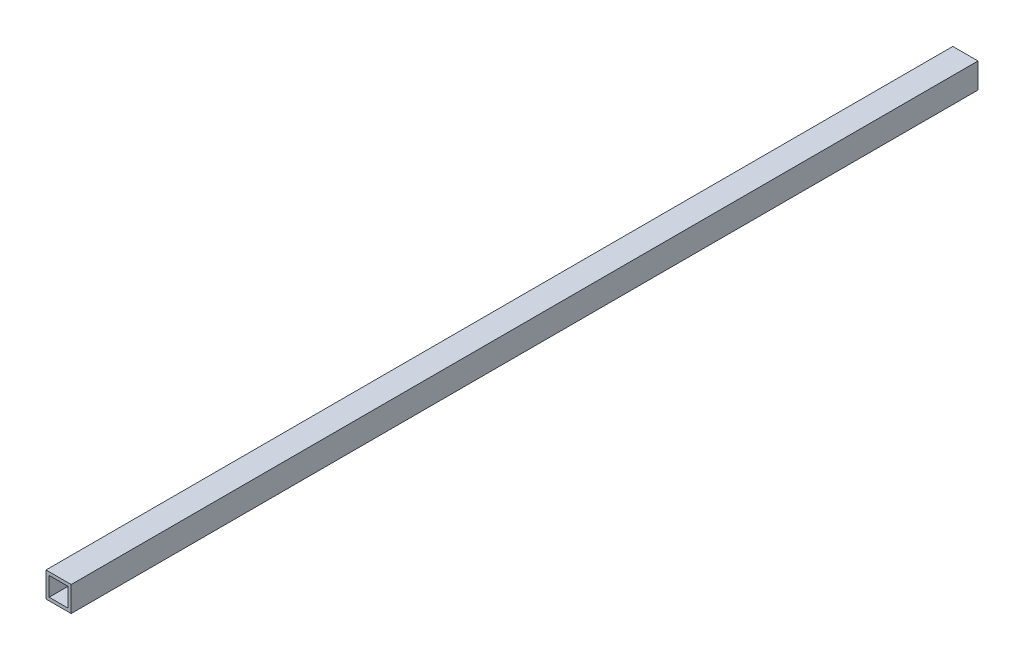
ISO-10303-21;
HEADER;
FILE_DESCRIPTION(('STEP AP214'),'2;1');
FILE_NAME('part.step','',(''),(''),'','','');
FILE_SCHEMA(('AUTOMOTIVE_DESIGN { 1 0 10303 214 1 1 1 1 }'));
ENDSEC;
DATA;
#1=APPLICATION_CONTEXT('core data for automotive mechanical design processes');
#2=APPLICATION_PROTOCOL_DEFINITION('international standard','automotive_design',2000,#1);
#3=PRODUCT_CONTEXT('',#1,'mechanical');
#4=PRODUCT('Part','Part','',(#3));
#5=PRODUCT_RELATED_PRODUCT_CATEGORY('part','',(#4));
#6=PRODUCT_DEFINITION_FORMATION('','',#4);
#7=PRODUCT_DEFINITION_CONTEXT('part definition',#1,'design');
#8=PRODUCT_DEFINITION('design','',#6,#7);
#9=PRODUCT_DEFINITION_SHAPE('','',#8);
#10=(LENGTH_UNIT() NAMED_UNIT(*) SI_UNIT(.MILLI.,.METRE.));
#11=(NAMED_UNIT(*) PLANE_ANGLE_UNIT() SI_UNIT($,.RADIAN.));
#12=(NAMED_UNIT(*) SI_UNIT($,.STERADIAN.) SOLID_ANGLE_UNIT());
#13=UNCERTAINTY_MEASURE_WITH_UNIT(LENGTH_MEASURE(1.E-05),#10,'distance_accuracy_value','');
#14=(GEOMETRIC_REPRESENTATION_CONTEXT(3) GLOBAL_UNCERTAINTY_ASSIGNED_CONTEXT((#13)) GLOBAL_UNIT_ASSIGNED_CONTEXT((#10,
#11,#12)) REPRESENTATION_CONTEXT('',''));
#15=CARTESIAN_POINT('',(0.,0.,0.));
#16=DIRECTION('',(0.,0.,1.));
#17=DIRECTION('',(1.,0.,0.));
#18=AXIS2_PLACEMENT_3D('',#15,#16,#17);
#19=CARTESIAN_POINT('',(0.,0.,457.2));
#20=DIRECTION('',(0.,0.,1.));
#21=DIRECTION('',(1.,0.,0.));
#22=AXIS2_PLACEMENT_3D('',#19,#20,#21);
#23=PLANE('',#22);
#24=DIRECTION('',(0.,-1.,0.));
#25=VECTOR('',#24,1.);
#26=CARTESIAN_POINT('',(-12.7,12.7,457.2));
#27=LINE('',#26,#25);
#28=CARTESIAN_POINT('',(-12.7,12.7,457.2));
#29=VERTEX_POINT('',#28);
#30=CARTESIAN_POINT('',(-12.7,-12.7,457.2));
#31=VERTEX_POINT('',#30);
#32=EDGE_CURVE('E108',#29,#31,#27,.T.);
#33=ORIENTED_EDGE('',*,*,#32,.T.);
#34=DIRECTION('',(1.,0.,0.));
#35=VECTOR('',#34,1.);
#36=CARTESIAN_POINT('',(-12.7,-12.7,457.2));
#37=LINE('',#36,#35);
#38=CARTESIAN_POINT('',(12.7,-12.7,457.2));
#39=VERTEX_POINT('',#38);
#40=EDGE_CURVE('E151',#31,#39,#37,.T.);
#41=ORIENTED_EDGE('',*,*,#40,.T.);
#42=DIRECTION('',(0.,1.,0.));
#43=VECTOR('',#42,1.);
#44=CARTESIAN_POINT('',(12.7,-12.7,457.2));
#45=LINE('',#44,#43);
#46=CARTESIAN_POINT('',(12.7,12.7,457.2));
#47=VERTEX_POINT('',#46);
#48=EDGE_CURVE('E153',#39,#47,#45,.T.);
#49=ORIENTED_EDGE('',*,*,#48,.T.);
#50=DIRECTION('',(-1.,0.,0.));
#51=VECTOR('',#50,1.);
#52=CARTESIAN_POINT('',(12.7,12.7,457.2));
#53=LINE('',#52,#51);
#54=EDGE_CURVE('E55',#47,#29,#53,.T.);
#55=ORIENTED_EDGE('',*,*,#54,.T.);
#56=EDGE_LOOP('',(#33,#41,#49,#55));
#57=FACE_BOUND('',#56,.T.);
#58=DIRECTION('',(1.,0.,0.));
#59=VECTOR('',#58,1.);
#60=CARTESIAN_POINT('',(-9.525,-9.525,457.2));
#61=LINE('',#60,#59);
#62=CARTESIAN_POINT('',(-9.525,-9.525,457.2));
#63=VERTEX_POINT('',#62);
#64=CARTESIAN_POINT('',(9.52500000000001,-9.525,457.2));
#65=VERTEX_POINT('',#64);
#66=EDGE_CURVE('E140',#63,#65,#61,.T.);
#67=ORIENTED_EDGE('',*,*,#66,.F.);
#68=DIRECTION('',(0.,-1.,0.));
#69=VECTOR('',#68,1.);
#70=CARTESIAN_POINT('',(-9.52500000000001,9.525,457.2));
#71=LINE('',#70,#69);
#72=CARTESIAN_POINT('',(-9.52500000000001,9.525,457.2));
#73=VERTEX_POINT('',#72);
#74=EDGE_CURVE('E105',#73,#63,#71,.T.);
#75=ORIENTED_EDGE('',*,*,#74,.F.);
#76=DIRECTION('',(-1.,0.,0.));
#77=VECTOR('',#76,1.);
#78=CARTESIAN_POINT('',(9.525,9.525,457.2));
#79=LINE('',#78,#77);
#80=CARTESIAN_POINT('',(9.525,9.525,457.2));
#81=VERTEX_POINT('',#80);
#82=EDGE_CURVE('E144',#81,#73,#79,.T.);
#83=ORIENTED_EDGE('',*,*,#82,.F.);
#84=DIRECTION('',(0.,1.,0.));
#85=VECTOR('',#84,1.);
#86=CARTESIAN_POINT('',(9.52500000000001,-9.525,457.2));
#87=LINE('',#86,#85);
#88=EDGE_CURVE('E142',#65,#81,#87,.T.);
#89=ORIENTED_EDGE('',*,*,#88,.F.);
#90=EDGE_LOOP('',(#67,#75,#83,#89));
#91=FACE_BOUND('',#90,.T.);
#92=ADVANCED_FACE('F32',(#57,#91),#23,.T.);
#93=CARTESIAN_POINT('',(-12.7,12.7,457.2));
#94=DIRECTION('',(1.,0.,0.));
#95=DIRECTION('',(0.,0.,-1.));
#96=AXIS2_PLACEMENT_3D('',#93,#94,#95);
#97=PLANE('',#96);
#98=DIRECTION('',(0.,0.,-1.));
#99=VECTOR('',#98,1.);
#100=CARTESIAN_POINT('',(-12.7,12.7,457.2));
#101=LINE('',#100,#99);
#102=CARTESIAN_POINT('',(-12.7,12.7,-457.2));
#103=VERTEX_POINT('',#102);
#104=EDGE_CURVE('E156',#29,#103,#101,.T.);
#105=ORIENTED_EDGE('',*,*,#104,.T.);
#106=DIRECTION('',(0.,-1.,0.));
#107=VECTOR('',#106,1.);
#108=CARTESIAN_POINT('',(-12.7,12.7,-457.2));
#109=LINE('',#108,#107);
#110=CARTESIAN_POINT('',(-12.7,-12.7,-457.2));
#111=VERTEX_POINT('',#110);
#112=EDGE_CURVE('E127',#103,#111,#109,.T.);
#113=ORIENTED_EDGE('',*,*,#112,.T.);
#114=DIRECTION('',(0.,0.,-1.));
#115=VECTOR('',#114,1.);
#116=CARTESIAN_POINT('',(-12.7,-12.7,457.2));
#117=LINE('',#116,#115);
#118=EDGE_CURVE('E11',#31,#111,#117,.T.);
#119=ORIENTED_EDGE('',*,*,#118,.F.);
#120=ORIENTED_EDGE('',*,*,#32,.F.);
#121=EDGE_LOOP('',(#105,#113,#119,#120));
#122=FACE_BOUND('',#121,.T.);
#123=ADVANCED_FACE('F34',(#122),#97,.F.);
#124=CARTESIAN_POINT('',(-12.7,-12.7,457.2));
#125=DIRECTION('',(0.,1.,0.));
#126=DIRECTION('',(-1.,0.,0.));
#127=AXIS2_PLACEMENT_3D('',#124,#125,#126);
#128=PLANE('',#127);
#129=ORIENTED_EDGE('',*,*,#118,.T.);
#130=DIRECTION('',(1.,0.,0.));
#131=VECTOR('',#130,1.);
#132=CARTESIAN_POINT('',(-12.7,-12.7,-457.2));
#133=LINE('',#132,#131);
#134=CARTESIAN_POINT('',(12.7,-12.7,-457.2));
#135=VERTEX_POINT('',#134);
#136=EDGE_CURVE('E130',#111,#135,#133,.T.);
#137=ORIENTED_EDGE('',*,*,#136,.T.);
#138=DIRECTION('',(0.,0.,-1.));
#139=VECTOR('',#138,1.);
#140=CARTESIAN_POINT('',(12.7,-12.7,457.2));
#141=LINE('',#140,#139);
#142=EDGE_CURVE('E40',#39,#135,#141,.T.);
#143=ORIENTED_EDGE('',*,*,#142,.F.);
#144=ORIENTED_EDGE('',*,*,#40,.F.);
#145=EDGE_LOOP('',(#129,#137,#143,#144));
#146=FACE_BOUND('',#145,.T.);
#147=ADVANCED_FACE('F169',(#146),#128,.F.);
#148=CARTESIAN_POINT('',(12.7,-12.7,457.2));
#149=DIRECTION('',(-1.,0.,0.));
#150=DIRECTION('',(0.,0.,1.));
#151=AXIS2_PLACEMENT_3D('',#148,#149,#150);
#152=PLANE('',#151);
#153=ORIENTED_EDGE('',*,*,#142,.T.);
#154=DIRECTION('',(0.,1.,0.));
#155=VECTOR('',#154,1.);
#156=CARTESIAN_POINT('',(12.7,-12.7,-457.2));
#157=LINE('',#156,#155);
#158=CARTESIAN_POINT('',(12.7,12.7,-457.2));
#159=VERTEX_POINT('',#158);
#160=EDGE_CURVE('E133',#135,#159,#157,.T.);
#161=ORIENTED_EDGE('',*,*,#160,.T.);
#162=DIRECTION('',(0.,0.,-1.));
#163=VECTOR('',#162,1.);
#164=CARTESIAN_POINT('',(12.7,12.7,457.2));
#165=LINE('',#164,#163);
#166=EDGE_CURVE('E158',#47,#159,#165,.T.);
#167=ORIENTED_EDGE('',*,*,#166,.F.);
#168=ORIENTED_EDGE('',*,*,#48,.F.);
#169=EDGE_LOOP('',(#153,#161,#167,#168));
#170=FACE_BOUND('',#169,.T.);
#171=ADVANCED_FACE('F163',(#170),#152,.F.);
#172=CARTESIAN_POINT('',(12.7,12.7,457.2));
#173=DIRECTION('',(0.,-1.,0.));
#174=DIRECTION('',(1.,0.,0.));
#175=AXIS2_PLACEMENT_3D('',#172,#173,#174);
#176=PLANE('',#175);
#177=ORIENTED_EDGE('',*,*,#166,.T.);
#178=DIRECTION('',(-1.,0.,0.));
#179=VECTOR('',#178,1.);
#180=CARTESIAN_POINT('',(12.7,12.7,-457.2));
#181=LINE('',#180,#179);
#182=EDGE_CURVE('E136',#159,#103,#181,.T.);
#183=ORIENTED_EDGE('',*,*,#182,.T.);
#184=ORIENTED_EDGE('',*,*,#104,.F.);
#185=ORIENTED_EDGE('',*,*,#54,.F.);
#186=EDGE_LOOP('',(#177,#183,#184,#185));
#187=FACE_BOUND('',#186,.T.);
#188=ADVANCED_FACE('F174',(#187),#176,.F.);
#189=CARTESIAN_POINT('',(-9.52500000000001,9.525,457.2));
#190=DIRECTION('',(1.,0.,0.));
#191=DIRECTION('',(0.,1.,0.));
#192=AXIS2_PLACEMENT_3D('',#189,#190,#191);
#193=PLANE('',#192);
#194=DIRECTION('',(0.,0.,-1.));
#195=VECTOR('',#194,1.);
#196=CARTESIAN_POINT('',(-9.525,-9.525,457.2));
#197=LINE('',#196,#195);
#198=CARTESIAN_POINT('',(-9.525,-9.525,-457.2));
#199=VERTEX_POINT('',#198);
#200=EDGE_CURVE('E97',#63,#199,#197,.T.);
#201=ORIENTED_EDGE('',*,*,#200,.T.);
#202=DIRECTION('',(0.,-1.,0.));
#203=VECTOR('',#202,1.);
#204=CARTESIAN_POINT('',(-9.52500000000001,9.525,-457.2));
#205=LINE('',#204,#203);
#206=CARTESIAN_POINT('',(-9.52500000000001,9.525,-457.2));
#207=VERTEX_POINT('',#206);
#208=EDGE_CURVE('E102',#207,#199,#205,.T.);
#209=ORIENTED_EDGE('',*,*,#208,.F.);
#210=DIRECTION('',(0.,0.,-1.));
#211=VECTOR('',#210,1.);
#212=CARTESIAN_POINT('',(-9.52500000000001,9.525,457.2));
#213=LINE('',#212,#211);
#214=EDGE_CURVE('E146',#73,#207,#213,.T.);
#215=ORIENTED_EDGE('',*,*,#214,.F.);
#216=ORIENTED_EDGE('',*,*,#74,.T.);
#217=EDGE_LOOP('',(#201,#209,#215,#216));
#218=FACE_BOUND('',#217,.T.);
#219=ADVANCED_FACE('F99',(#218),#193,.T.);
#220=CARTESIAN_POINT('',(-9.525,-9.525,457.2));
#221=DIRECTION('',(0.,1.,0.));
#222=DIRECTION('',(0.,0.,1.));
#223=AXIS2_PLACEMENT_3D('',#220,#221,#222);
#224=PLANE('',#223);
#225=DIRECTION('',(0.,0.,-1.));
#226=VECTOR('',#225,1.);
#227=CARTESIAN_POINT('',(9.52500000000001,-9.525,457.2));
#228=LINE('',#227,#226);
#229=CARTESIAN_POINT('',(9.52500000000001,-9.525,-457.2));
#230=VERTEX_POINT('',#229);
#231=EDGE_CURVE('E109',#65,#230,#228,.T.);
#232=ORIENTED_EDGE('',*,*,#231,.T.);
#233=DIRECTION('',(1.,0.,0.));
#234=VECTOR('',#233,1.);
#235=CARTESIAN_POINT('',(-9.525,-9.525,-457.2));
#236=LINE('',#235,#234);
#237=EDGE_CURVE('E112',#199,#230,#236,.T.);
#238=ORIENTED_EDGE('',*,*,#237,.F.);
#239=ORIENTED_EDGE('',*,*,#200,.F.);
#240=ORIENTED_EDGE('',*,*,#66,.T.);
#241=EDGE_LOOP('',(#232,#238,#239,#240));
#242=FACE_BOUND('',#241,.T.);
#243=ADVANCED_FACE('F113',(#242),#224,.T.);
#244=CARTESIAN_POINT('',(9.52500000000001,-9.525,457.2));
#245=DIRECTION('',(-1.,0.,0.));
#246=DIRECTION('',(0.,-1.,0.));
#247=AXIS2_PLACEMENT_3D('',#244,#245,#246);
#248=PLANE('',#247);
#249=DIRECTION('',(0.,0.,-1.));
#250=VECTOR('',#249,1.);
#251=CARTESIAN_POINT('',(9.525,9.525,457.2));
#252=LINE('',#251,#250);
#253=CARTESIAN_POINT('',(9.525,9.525,-457.2));
#254=VERTEX_POINT('',#253);
#255=EDGE_CURVE('E47',#81,#254,#252,.T.);
#256=ORIENTED_EDGE('',*,*,#255,.T.);
#257=DIRECTION('',(0.,1.,0.));
#258=VECTOR('',#257,1.);
#259=CARTESIAN_POINT('',(9.52500000000001,-9.525,-457.2));
#260=LINE('',#259,#258);
#261=EDGE_CURVE('E118',#230,#254,#260,.T.);
#262=ORIENTED_EDGE('',*,*,#261,.F.);
#263=ORIENTED_EDGE('',*,*,#231,.F.);
#264=ORIENTED_EDGE('',*,*,#88,.T.);
#265=EDGE_LOOP('',(#256,#262,#263,#264));
#266=FACE_BOUND('',#265,.T.);
#267=ADVANCED_FACE('F192',(#266),#248,.T.);
#268=CARTESIAN_POINT('',(9.525,9.525,457.2));
#269=DIRECTION('',(0.,-1.,0.));
#270=DIRECTION('',(0.,0.,-1.));
#271=AXIS2_PLACEMENT_3D('',#268,#269,#270);
#272=PLANE('',#271);
#273=ORIENTED_EDGE('',*,*,#214,.T.);
#274=DIRECTION('',(-1.,0.,0.));
#275=VECTOR('',#274,1.);
#276=CARTESIAN_POINT('',(9.525,9.525,-457.2));
#277=LINE('',#276,#275);
#278=EDGE_CURVE('E122',#254,#207,#277,.T.);
#279=ORIENTED_EDGE('',*,*,#278,.F.);
#280=ORIENTED_EDGE('',*,*,#255,.F.);
#281=ORIENTED_EDGE('',*,*,#82,.T.);
#282=EDGE_LOOP('',(#273,#279,#280,#281));
#283=FACE_BOUND('',#282,.T.);
#284=ADVANCED_FACE('F195',(#283),#272,.T.);
#285=CARTESIAN_POINT('',(0.,0.,-457.2));
#286=DIRECTION('',(0.,0.,1.));
#287=DIRECTION('',(1.,0.,0.));
#288=AXIS2_PLACEMENT_3D('',#285,#286,#287);
#289=PLANE('',#288);
#290=ORIENTED_EDGE('',*,*,#278,.T.);
#291=ORIENTED_EDGE('',*,*,#208,.T.);
#292=ORIENTED_EDGE('',*,*,#237,.T.);
#293=ORIENTED_EDGE('',*,*,#261,.T.);
#294=EDGE_LOOP('',(#290,#291,#292,#293));
#295=FACE_BOUND('',#294,.T.);
#296=ORIENTED_EDGE('',*,*,#112,.F.);
#297=ORIENTED_EDGE('',*,*,#182,.F.);
#298=ORIENTED_EDGE('',*,*,#160,.F.);
#299=ORIENTED_EDGE('',*,*,#136,.F.);
#300=EDGE_LOOP('',(#296,#297,#298,#299));
#301=FACE_BOUND('',#300,.T.);
#302=ADVANCED_FACE('F120',(#295,#301),#289,.F.);
#303=CLOSED_SHELL('',(#92,#123,#147,#171,#188,#219,#243,#267,#284,#302));
#304=MANIFOLD_SOLID_BREP('B2',#303);
#305=ADVANCED_BREP_SHAPE_REPRESENTATION('',(#18,#304),#14);
#306=SHAPE_DEFINITION_REPRESENTATION(#9,#305);
ENDSEC;
END-ISO-10303-21;
